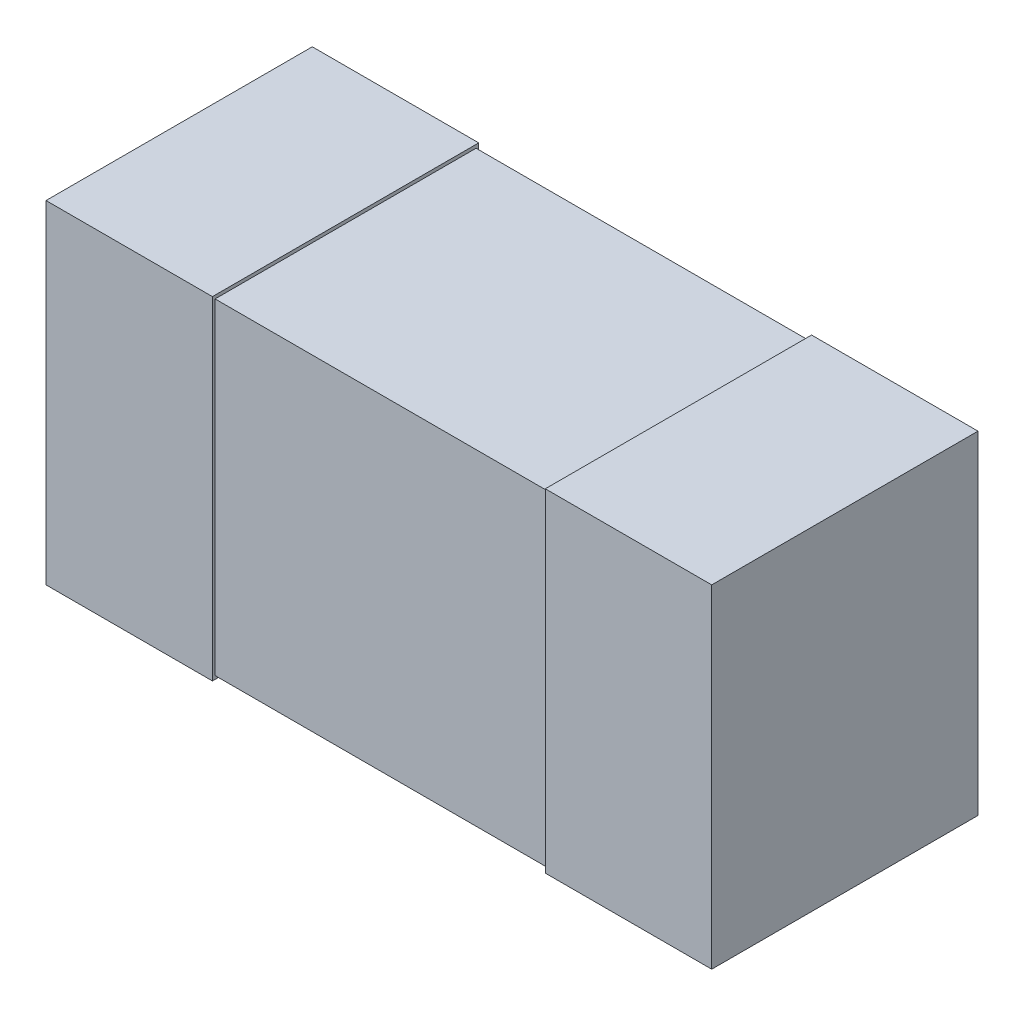
ISO-10303-21;
HEADER;
FILE_DESCRIPTION(('STEP AP214'),'2;1');
FILE_NAME('part.step','',(''),(''),'','','');
FILE_SCHEMA(('AUTOMOTIVE_DESIGN { 1 0 10303 214 1 1 1 1 }'));
ENDSEC;
DATA;
#1=APPLICATION_CONTEXT('core data for automotive mechanical design processes');
#2=APPLICATION_PROTOCOL_DEFINITION('international standard','automotive_design',2000,#1);
#3=PRODUCT_CONTEXT('',#1,'mechanical');
#4=PRODUCT('Part','Part','',(#3));
#5=PRODUCT_RELATED_PRODUCT_CATEGORY('part','',(#4));
#6=PRODUCT_DEFINITION_FORMATION('','',#4);
#7=PRODUCT_DEFINITION_CONTEXT('part definition',#1,'design');
#8=PRODUCT_DEFINITION('design','',#6,#7);
#9=PRODUCT_DEFINITION_SHAPE('','',#8);
#10=(LENGTH_UNIT() NAMED_UNIT(*) SI_UNIT(.MILLI.,.METRE.));
#11=(NAMED_UNIT(*) PLANE_ANGLE_UNIT() SI_UNIT($,.RADIAN.));
#12=(NAMED_UNIT(*) SI_UNIT($,.STERADIAN.) SOLID_ANGLE_UNIT());
#13=UNCERTAINTY_MEASURE_WITH_UNIT(LENGTH_MEASURE(1.E-05),#10,'distance_accuracy_value','');
#14=(GEOMETRIC_REPRESENTATION_CONTEXT(3) GLOBAL_UNCERTAINTY_ASSIGNED_CONTEXT((#13)) GLOBAL_UNIT_ASSIGNED_CONTEXT((#10,
#11,#12)) REPRESENTATION_CONTEXT('',''));
#15=CARTESIAN_POINT('',(0.,0.,0.));
#16=DIRECTION('',(0.,0.,1.));
#17=DIRECTION('',(1.,0.,0.));
#18=AXIS2_PLACEMENT_3D('',#15,#16,#17);
#19=CARTESIAN_POINT('',(-0.25,0.25,0.));
#20=DIRECTION('',(1.,0.,0.));
#21=DIRECTION('',(0.,0.,1.));
#22=AXIS2_PLACEMENT_3D('',#19,#20,#21);
#23=PLANE('',#22);
#24=DIRECTION('',(0.,0.,-1.));
#25=VECTOR('',#24,1.);
#26=CARTESIAN_POINT('',(-0.25,0.25,0.2));
#27=LINE('',#26,#25);
#28=CARTESIAN_POINT('',(-0.25,0.25,0.4));
#29=VERTEX_POINT('',#28);
#30=CARTESIAN_POINT('',(-0.25,0.25,0.));
#31=VERTEX_POINT('',#30);
#32=EDGE_CURVE('P0_E77',#29,#31,#27,.T.);
#33=ORIENTED_EDGE('',*,*,#32,.F.);
#34=DIRECTION('',(0.,1.,0.));
#35=VECTOR('',#34,1.);
#36=CARTESIAN_POINT('',(-0.25,0.,0.4));
#37=LINE('',#36,#35);
#38=CARTESIAN_POINT('',(-0.25,-0.25,0.4));
#39=VERTEX_POINT('',#38);
#40=EDGE_CURVE('P0_E59',#39,#29,#37,.T.);
#41=ORIENTED_EDGE('',*,*,#40,.F.);
#42=DIRECTION('',(0.,0.,-1.));
#43=VECTOR('',#42,1.);
#44=CARTESIAN_POINT('',(-0.25,-0.25,0.2));
#45=LINE('',#44,#43);
#46=CARTESIAN_POINT('',(-0.25,-0.25,0.));
#47=VERTEX_POINT('',#46);
#48=EDGE_CURVE('P0_E21',#39,#47,#45,.T.);
#49=ORIENTED_EDGE('',*,*,#48,.T.);
#50=DIRECTION('',(0.,1.,0.));
#51=VECTOR('',#50,1.);
#52=CARTESIAN_POINT('',(-0.25,0.,0.));
#53=LINE('',#52,#51);
#54=EDGE_CURVE('P0_E56',#47,#31,#53,.T.);
#55=ORIENTED_EDGE('',*,*,#54,.T.);
#56=EDGE_LOOP('',(#33,#41,#49,#55));
#57=FACE_BOUND('',#56,.T.);
#58=ADVANCED_FACE('P0_F17',(#57),#23,.T.);
#59=CARTESIAN_POINT('',(-0.5,-0.25,0.));
#60=DIRECTION('',(0.,1.,0.));
#61=DIRECTION('',(0.,0.,1.));
#62=AXIS2_PLACEMENT_3D('',#59,#60,#61);
#63=PLANE('',#62);
#64=DIRECTION('',(1.,0.,0.));
#65=VECTOR('',#64,1.);
#66=CARTESIAN_POINT('',(-0.375,-0.25,0.4));
#67=LINE('',#66,#65);
#68=CARTESIAN_POINT('',(-0.5,-0.25,0.4));
#69=VERTEX_POINT('',#68);
#70=EDGE_CURVE('P0_E79',#69,#39,#67,.T.);
#71=ORIENTED_EDGE('',*,*,#70,.F.);
#72=DIRECTION('',(0.,0.,-1.));
#73=VECTOR('',#72,1.);
#74=CARTESIAN_POINT('',(-0.5,-0.25,0.2));
#75=LINE('',#74,#73);
#76=CARTESIAN_POINT('',(-0.5,-0.25,0.));
#77=VERTEX_POINT('',#76);
#78=EDGE_CURVE('P0_E74',#69,#77,#75,.T.);
#79=ORIENTED_EDGE('',*,*,#78,.T.);
#80=DIRECTION('',(1.,0.,0.));
#81=VECTOR('',#80,1.);
#82=CARTESIAN_POINT('',(-0.375,-0.25,0.));
#83=LINE('',#82,#81);
#84=EDGE_CURVE('P0_E64',#77,#47,#83,.T.);
#85=ORIENTED_EDGE('',*,*,#84,.T.);
#86=ORIENTED_EDGE('',*,*,#48,.F.);
#87=EDGE_LOOP('',(#71,#79,#85,#86));
#88=FACE_BOUND('',#87,.T.);
#89=ADVANCED_FACE('P0_F73',(#88),#63,.F.);
#90=CARTESIAN_POINT('',(-0.5,-0.25,0.));
#91=DIRECTION('',(0.,0.,1.));
#92=DIRECTION('',(1.,0.,0.));
#93=AXIS2_PLACEMENT_3D('',#90,#91,#92);
#94=PLANE('',#93);
#95=ORIENTED_EDGE('',*,*,#54,.F.);
#96=ORIENTED_EDGE('',*,*,#84,.F.);
#97=DIRECTION('',(0.,1.,0.));
#98=VECTOR('',#97,1.);
#99=CARTESIAN_POINT('',(-0.5,0.,0.));
#100=LINE('',#99,#98);
#101=CARTESIAN_POINT('',(-0.5,0.25,0.));
#102=VERTEX_POINT('',#101);
#103=EDGE_CURVE('P0_E84',#77,#102,#100,.T.);
#104=ORIENTED_EDGE('',*,*,#103,.T.);
#105=DIRECTION('',(-1.,0.,0.));
#106=VECTOR('',#105,1.);
#107=CARTESIAN_POINT('',(-0.375,0.25,0.));
#108=LINE('',#107,#106);
#109=EDGE_CURVE('P0_E70',#31,#102,#108,.T.);
#110=ORIENTED_EDGE('',*,*,#109,.F.);
#111=EDGE_LOOP('',(#95,#96,#104,#110));
#112=FACE_BOUND('',#111,.T.);
#113=ADVANCED_FACE('P0_F67',(#112),#94,.F.);
#114=CARTESIAN_POINT('',(-0.5,0.25,0.));
#115=DIRECTION('',(0.,1.,0.));
#116=DIRECTION('',(0.,0.,1.));
#117=AXIS2_PLACEMENT_3D('',#114,#115,#116);
#118=PLANE('',#117);
#119=DIRECTION('',(-1.,0.,0.));
#120=VECTOR('',#119,1.);
#121=CARTESIAN_POINT('',(-0.375,0.25,0.4));
#122=LINE('',#121,#120);
#123=CARTESIAN_POINT('',(-0.5,0.25,0.4));
#124=VERTEX_POINT('',#123);
#125=EDGE_CURVE('P0_E35',#29,#124,#122,.T.);
#126=ORIENTED_EDGE('',*,*,#125,.F.);
#127=ORIENTED_EDGE('',*,*,#32,.T.);
#128=ORIENTED_EDGE('',*,*,#109,.T.);
#129=DIRECTION('',(0.,0.,1.));
#130=VECTOR('',#129,1.);
#131=CARTESIAN_POINT('',(-0.5,0.25,0.2));
#132=LINE('',#131,#130);
#133=EDGE_CURVE('P0_E27',#102,#124,#132,.T.);
#134=ORIENTED_EDGE('',*,*,#133,.T.);
#135=EDGE_LOOP('',(#126,#127,#128,#134));
#136=FACE_BOUND('',#135,.T.);
#137=ADVANCED_FACE('P0_F89',(#136),#118,.T.);
#138=CARTESIAN_POINT('',(-0.5,-0.25,0.4));
#139=DIRECTION('',(0.,0.,1.));
#140=DIRECTION('',(1.,0.,0.));
#141=AXIS2_PLACEMENT_3D('',#138,#139,#140);
#142=PLANE('',#141);
#143=ORIENTED_EDGE('',*,*,#40,.T.);
#144=ORIENTED_EDGE('',*,*,#125,.T.);
#145=DIRECTION('',(0.,-1.,0.));
#146=VECTOR('',#145,1.);
#147=CARTESIAN_POINT('',(-0.5,0.,0.4));
#148=LINE('',#147,#146);
#149=EDGE_CURVE('P0_E11',#124,#69,#148,.T.);
#150=ORIENTED_EDGE('',*,*,#149,.T.);
#151=ORIENTED_EDGE('',*,*,#70,.T.);
#152=EDGE_LOOP('',(#143,#144,#150,#151));
#153=FACE_BOUND('',#152,.T.);
#154=ADVANCED_FACE('P0_F91',(#153),#142,.T.);
#155=CARTESIAN_POINT('',(-0.5,0.25,0.));
#156=DIRECTION('',(1.,0.,0.));
#157=DIRECTION('',(0.,0.,1.));
#158=AXIS2_PLACEMENT_3D('',#155,#156,#157);
#159=PLANE('',#158);
#160=ORIENTED_EDGE('',*,*,#133,.F.);
#161=ORIENTED_EDGE('',*,*,#103,.F.);
#162=ORIENTED_EDGE('',*,*,#78,.F.);
#163=ORIENTED_EDGE('',*,*,#149,.F.);
#164=EDGE_LOOP('',(#160,#161,#162,#163));
#165=FACE_BOUND('',#164,.T.);
#166=ADVANCED_FACE('P0_F19',(#165),#159,.F.);
#167=CLOSED_SHELL('',(#58,#89,#113,#137,#154,#166));
#168=MANIFOLD_SOLID_BREP('P0_B1',#167);
#169=CARTESIAN_POINT('',(-0.25,-0.245,0.396));
#170=DIRECTION('',(0.,0.,1.));
#171=DIRECTION('',(1.,0.,0.));
#172=AXIS2_PLACEMENT_3D('',#169,#170,#171);
#173=PLANE('',#172);
#174=DIRECTION('',(0.,-1.,0.));
#175=VECTOR('',#174,1.);
#176=CARTESIAN_POINT('',(0.25,0.,0.396));
#177=LINE('',#176,#175);
#178=CARTESIAN_POINT('',(0.25,0.245,0.396));
#179=VERTEX_POINT('',#178);
#180=CARTESIAN_POINT('',(0.25,-0.245,0.396));
#181=VERTEX_POINT('',#180);
#182=EDGE_CURVE('P1_E77',#179,#181,#177,.T.);
#183=ORIENTED_EDGE('',*,*,#182,.F.);
#184=DIRECTION('',(1.,0.,0.));
#185=VECTOR('',#184,1.);
#186=CARTESIAN_POINT('',(0.,0.245,0.396));
#187=LINE('',#186,#185);
#188=CARTESIAN_POINT('',(-0.25,0.245,0.396));
#189=VERTEX_POINT('',#188);
#190=EDGE_CURVE('P1_E59',#189,#179,#187,.T.);
#191=ORIENTED_EDGE('',*,*,#190,.F.);
#192=DIRECTION('',(0.,-1.,0.));
#193=VECTOR('',#192,1.);
#194=CARTESIAN_POINT('',(-0.25,0.,0.396));
#195=LINE('',#194,#193);
#196=CARTESIAN_POINT('',(-0.25,-0.245,0.396));
#197=VERTEX_POINT('',#196);
#198=EDGE_CURVE('P1_E21',#189,#197,#195,.T.);
#199=ORIENTED_EDGE('',*,*,#198,.T.);
#200=DIRECTION('',(1.,0.,0.));
#201=VECTOR('',#200,1.);
#202=CARTESIAN_POINT('',(0.,-0.245,0.396));
#203=LINE('',#202,#201);
#204=EDGE_CURVE('P1_E56',#197,#181,#203,.T.);
#205=ORIENTED_EDGE('',*,*,#204,.T.);
#206=EDGE_LOOP('',(#183,#191,#199,#205));
#207=FACE_BOUND('',#206,.T.);
#208=ADVANCED_FACE('P1_F17',(#207),#173,.T.);
#209=CARTESIAN_POINT('',(-0.25,0.245,0.004));
#210=DIRECTION('',(1.,0.,0.));
#211=DIRECTION('',(0.,0.,1.));
#212=AXIS2_PLACEMENT_3D('',#209,#210,#211);
#213=PLANE('',#212);
#214=DIRECTION('',(0.,0.,1.));
#215=VECTOR('',#214,1.);
#216=CARTESIAN_POINT('',(-0.25,0.245,0.2));
#217=LINE('',#216,#215);
#218=CARTESIAN_POINT('',(-0.25,0.245,0.004));
#219=VERTEX_POINT('',#218);
#220=EDGE_CURVE('P1_E79',#219,#189,#217,.T.);
#221=ORIENTED_EDGE('',*,*,#220,.F.);
#222=DIRECTION('',(0.,-1.,0.));
#223=VECTOR('',#222,1.);
#224=CARTESIAN_POINT('',(-0.25,0.,0.004));
#225=LINE('',#224,#223);
#226=CARTESIAN_POINT('',(-0.25,-0.245,0.004));
#227=VERTEX_POINT('',#226);
#228=EDGE_CURVE('P1_E74',#219,#227,#225,.T.);
#229=ORIENTED_EDGE('',*,*,#228,.T.);
#230=DIRECTION('',(0.,0.,1.));
#231=VECTOR('',#230,1.);
#232=CARTESIAN_POINT('',(-0.25,-0.245,0.2));
#233=LINE('',#232,#231);
#234=EDGE_CURVE('P1_E64',#227,#197,#233,.T.);
#235=ORIENTED_EDGE('',*,*,#234,.T.);
#236=ORIENTED_EDGE('',*,*,#198,.F.);
#237=EDGE_LOOP('',(#221,#229,#235,#236));
#238=FACE_BOUND('',#237,.T.);
#239=ADVANCED_FACE('P1_F73',(#238),#213,.F.);
#240=CARTESIAN_POINT('',(-0.25,-0.245,0.004));
#241=DIRECTION('',(0.,1.,0.));
#242=DIRECTION('',(0.,0.,1.));
#243=AXIS2_PLACEMENT_3D('',#240,#241,#242);
#244=PLANE('',#243);
#245=ORIENTED_EDGE('',*,*,#204,.F.);
#246=ORIENTED_EDGE('',*,*,#234,.F.);
#247=DIRECTION('',(1.,0.,0.));
#248=VECTOR('',#247,1.);
#249=CARTESIAN_POINT('',(0.,-0.245,0.004));
#250=LINE('',#249,#248);
#251=CARTESIAN_POINT('',(0.25,-0.245,0.004));
#252=VERTEX_POINT('',#251);
#253=EDGE_CURVE('P1_E84',#227,#252,#250,.T.);
#254=ORIENTED_EDGE('',*,*,#253,.T.);
#255=DIRECTION('',(0.,0.,-1.));
#256=VECTOR('',#255,1.);
#257=CARTESIAN_POINT('',(0.25,-0.245,0.2));
#258=LINE('',#257,#256);
#259=EDGE_CURVE('P1_E70',#181,#252,#258,.T.);
#260=ORIENTED_EDGE('',*,*,#259,.F.);
#261=EDGE_LOOP('',(#245,#246,#254,#260));
#262=FACE_BOUND('',#261,.T.);
#263=ADVANCED_FACE('P1_F67',(#262),#244,.F.);
#264=CARTESIAN_POINT('',(0.25,0.245,0.004));
#265=DIRECTION('',(1.,0.,0.));
#266=DIRECTION('',(0.,0.,1.));
#267=AXIS2_PLACEMENT_3D('',#264,#265,#266);
#268=PLANE('',#267);
#269=DIRECTION('',(0.,0.,-1.));
#270=VECTOR('',#269,1.);
#271=CARTESIAN_POINT('',(0.25,0.245,0.2));
#272=LINE('',#271,#270);
#273=CARTESIAN_POINT('',(0.25,0.245,0.004));
#274=VERTEX_POINT('',#273);
#275=EDGE_CURVE('P1_E35',#179,#274,#272,.T.);
#276=ORIENTED_EDGE('',*,*,#275,.F.);
#277=ORIENTED_EDGE('',*,*,#182,.T.);
#278=ORIENTED_EDGE('',*,*,#259,.T.);
#279=DIRECTION('',(0.,1.,0.));
#280=VECTOR('',#279,1.);
#281=CARTESIAN_POINT('',(0.25,0.,0.004));
#282=LINE('',#281,#280);
#283=EDGE_CURVE('P1_E27',#252,#274,#282,.T.);
#284=ORIENTED_EDGE('',*,*,#283,.T.);
#285=EDGE_LOOP('',(#276,#277,#278,#284));
#286=FACE_BOUND('',#285,.T.);
#287=ADVANCED_FACE('P1_F89',(#286),#268,.T.);
#288=CARTESIAN_POINT('',(-0.25,0.245,0.004));
#289=DIRECTION('',(0.,1.,0.));
#290=DIRECTION('',(0.,0.,1.));
#291=AXIS2_PLACEMENT_3D('',#288,#289,#290);
#292=PLANE('',#291);
#293=ORIENTED_EDGE('',*,*,#190,.T.);
#294=ORIENTED_EDGE('',*,*,#275,.T.);
#295=DIRECTION('',(-1.,0.,0.));
#296=VECTOR('',#295,1.);
#297=CARTESIAN_POINT('',(0.,0.245,0.004));
#298=LINE('',#297,#296);
#299=EDGE_CURVE('P1_E11',#274,#219,#298,.T.);
#300=ORIENTED_EDGE('',*,*,#299,.T.);
#301=ORIENTED_EDGE('',*,*,#220,.T.);
#302=EDGE_LOOP('',(#293,#294,#300,#301));
#303=FACE_BOUND('',#302,.T.);
#304=ADVANCED_FACE('P1_F91',(#303),#292,.T.);
#305=CARTESIAN_POINT('',(-0.25,-0.245,0.004));
#306=DIRECTION('',(0.,0.,1.));
#307=DIRECTION('',(1.,0.,0.));
#308=AXIS2_PLACEMENT_3D('',#305,#306,#307);
#309=PLANE('',#308);
#310=ORIENTED_EDGE('',*,*,#283,.F.);
#311=ORIENTED_EDGE('',*,*,#253,.F.);
#312=ORIENTED_EDGE('',*,*,#228,.F.);
#313=ORIENTED_EDGE('',*,*,#299,.F.);
#314=EDGE_LOOP('',(#310,#311,#312,#313));
#315=FACE_BOUND('',#314,.T.);
#316=ADVANCED_FACE('P1_F19',(#315),#309,.F.);
#317=CLOSED_SHELL('',(#208,#239,#263,#287,#304,#316));
#318=MANIFOLD_SOLID_BREP('P1_B1',#317);
#319=CARTESIAN_POINT('',(0.5,0.25,0.));
#320=DIRECTION('',(1.,0.,0.));
#321=DIRECTION('',(0.,0.,1.));
#322=AXIS2_PLACEMENT_3D('',#319,#320,#321);
#323=PLANE('',#322);
#324=DIRECTION('',(0.,0.,-1.));
#325=VECTOR('',#324,1.);
#326=CARTESIAN_POINT('',(0.5,0.25,0.2));
#327=LINE('',#326,#325);
#328=CARTESIAN_POINT('',(0.5,0.25,0.4));
#329=VERTEX_POINT('',#328);
#330=CARTESIAN_POINT('',(0.5,0.25,0.));
#331=VERTEX_POINT('',#330);
#332=EDGE_CURVE('P2_E77',#329,#331,#327,.T.);
#333=ORIENTED_EDGE('',*,*,#332,.F.);
#334=DIRECTION('',(0.,1.,0.));
#335=VECTOR('',#334,1.);
#336=CARTESIAN_POINT('',(0.5,0.,0.4));
#337=LINE('',#336,#335);
#338=CARTESIAN_POINT('',(0.5,-0.25,0.4));
#339=VERTEX_POINT('',#338);
#340=EDGE_CURVE('P2_E59',#339,#329,#337,.T.);
#341=ORIENTED_EDGE('',*,*,#340,.F.);
#342=DIRECTION('',(0.,0.,-1.));
#343=VECTOR('',#342,1.);
#344=CARTESIAN_POINT('',(0.5,-0.25,0.2));
#345=LINE('',#344,#343);
#346=CARTESIAN_POINT('',(0.5,-0.25,0.));
#347=VERTEX_POINT('',#346);
#348=EDGE_CURVE('P2_E21',#339,#347,#345,.T.);
#349=ORIENTED_EDGE('',*,*,#348,.T.);
#350=DIRECTION('',(0.,1.,0.));
#351=VECTOR('',#350,1.);
#352=CARTESIAN_POINT('',(0.5,0.,0.));
#353=LINE('',#352,#351);
#354=EDGE_CURVE('P2_E56',#347,#331,#353,.T.);
#355=ORIENTED_EDGE('',*,*,#354,.T.);
#356=EDGE_LOOP('',(#333,#341,#349,#355));
#357=FACE_BOUND('',#356,.T.);
#358=ADVANCED_FACE('P2_F17',(#357),#323,.T.);
#359=CARTESIAN_POINT('',(0.25,-0.25,0.));
#360=DIRECTION('',(0.,1.,0.));
#361=DIRECTION('',(0.,0.,1.));
#362=AXIS2_PLACEMENT_3D('',#359,#360,#361);
#363=PLANE('',#362);
#364=DIRECTION('',(1.,0.,0.));
#365=VECTOR('',#364,1.);
#366=CARTESIAN_POINT('',(0.375,-0.25,0.4));
#367=LINE('',#366,#365);
#368=CARTESIAN_POINT('',(0.25,-0.25,0.4));
#369=VERTEX_POINT('',#368);
#370=EDGE_CURVE('P2_E79',#369,#339,#367,.T.);
#371=ORIENTED_EDGE('',*,*,#370,.F.);
#372=DIRECTION('',(0.,0.,-1.));
#373=VECTOR('',#372,1.);
#374=CARTESIAN_POINT('',(0.25,-0.25,0.2));
#375=LINE('',#374,#373);
#376=CARTESIAN_POINT('',(0.25,-0.25,0.));
#377=VERTEX_POINT('',#376);
#378=EDGE_CURVE('P2_E74',#369,#377,#375,.T.);
#379=ORIENTED_EDGE('',*,*,#378,.T.);
#380=DIRECTION('',(1.,0.,0.));
#381=VECTOR('',#380,1.);
#382=CARTESIAN_POINT('',(0.375,-0.25,0.));
#383=LINE('',#382,#381);
#384=EDGE_CURVE('P2_E64',#377,#347,#383,.T.);
#385=ORIENTED_EDGE('',*,*,#384,.T.);
#386=ORIENTED_EDGE('',*,*,#348,.F.);
#387=EDGE_LOOP('',(#371,#379,#385,#386));
#388=FACE_BOUND('',#387,.T.);
#389=ADVANCED_FACE('P2_F73',(#388),#363,.F.);
#390=CARTESIAN_POINT('',(0.25,-0.25,0.));
#391=DIRECTION('',(0.,0.,1.));
#392=DIRECTION('',(1.,0.,0.));
#393=AXIS2_PLACEMENT_3D('',#390,#391,#392);
#394=PLANE('',#393);
#395=ORIENTED_EDGE('',*,*,#354,.F.);
#396=ORIENTED_EDGE('',*,*,#384,.F.);
#397=DIRECTION('',(0.,1.,0.));
#398=VECTOR('',#397,1.);
#399=CARTESIAN_POINT('',(0.25,0.,0.));
#400=LINE('',#399,#398);
#401=CARTESIAN_POINT('',(0.25,0.25,0.));
#402=VERTEX_POINT('',#401);
#403=EDGE_CURVE('P2_E84',#377,#402,#400,.T.);
#404=ORIENTED_EDGE('',*,*,#403,.T.);
#405=DIRECTION('',(-1.,0.,0.));
#406=VECTOR('',#405,1.);
#407=CARTESIAN_POINT('',(0.375,0.25,0.));
#408=LINE('',#407,#406);
#409=EDGE_CURVE('P2_E70',#331,#402,#408,.T.);
#410=ORIENTED_EDGE('',*,*,#409,.F.);
#411=EDGE_LOOP('',(#395,#396,#404,#410));
#412=FACE_BOUND('',#411,.T.);
#413=ADVANCED_FACE('P2_F67',(#412),#394,.F.);
#414=CARTESIAN_POINT('',(0.25,0.25,0.));
#415=DIRECTION('',(0.,1.,0.));
#416=DIRECTION('',(0.,0.,1.));
#417=AXIS2_PLACEMENT_3D('',#414,#415,#416);
#418=PLANE('',#417);
#419=DIRECTION('',(-1.,0.,0.));
#420=VECTOR('',#419,1.);
#421=CARTESIAN_POINT('',(0.375,0.25,0.4));
#422=LINE('',#421,#420);
#423=CARTESIAN_POINT('',(0.25,0.25,0.4));
#424=VERTEX_POINT('',#423);
#425=EDGE_CURVE('P2_E35',#329,#424,#422,.T.);
#426=ORIENTED_EDGE('',*,*,#425,.F.);
#427=ORIENTED_EDGE('',*,*,#332,.T.);
#428=ORIENTED_EDGE('',*,*,#409,.T.);
#429=DIRECTION('',(0.,0.,1.));
#430=VECTOR('',#429,1.);
#431=CARTESIAN_POINT('',(0.25,0.25,0.2));
#432=LINE('',#431,#430);
#433=EDGE_CURVE('P2_E27',#402,#424,#432,.T.);
#434=ORIENTED_EDGE('',*,*,#433,.T.);
#435=EDGE_LOOP('',(#426,#427,#428,#434));
#436=FACE_BOUND('',#435,.T.);
#437=ADVANCED_FACE('P2_F89',(#436),#418,.T.);
#438=CARTESIAN_POINT('',(0.25,-0.25,0.4));
#439=DIRECTION('',(0.,0.,1.));
#440=DIRECTION('',(1.,0.,0.));
#441=AXIS2_PLACEMENT_3D('',#438,#439,#440);
#442=PLANE('',#441);
#443=ORIENTED_EDGE('',*,*,#340,.T.);
#444=ORIENTED_EDGE('',*,*,#425,.T.);
#445=DIRECTION('',(0.,-1.,0.));
#446=VECTOR('',#445,1.);
#447=CARTESIAN_POINT('',(0.25,0.,0.4));
#448=LINE('',#447,#446);
#449=EDGE_CURVE('P2_E11',#424,#369,#448,.T.);
#450=ORIENTED_EDGE('',*,*,#449,.T.);
#451=ORIENTED_EDGE('',*,*,#370,.T.);
#452=EDGE_LOOP('',(#443,#444,#450,#451));
#453=FACE_BOUND('',#452,.T.);
#454=ADVANCED_FACE('P2_F91',(#453),#442,.T.);
#455=CARTESIAN_POINT('',(0.25,0.25,0.));
#456=DIRECTION('',(1.,0.,0.));
#457=DIRECTION('',(0.,0.,1.));
#458=AXIS2_PLACEMENT_3D('',#455,#456,#457);
#459=PLANE('',#458);
#460=ORIENTED_EDGE('',*,*,#433,.F.);
#461=ORIENTED_EDGE('',*,*,#403,.F.);
#462=ORIENTED_EDGE('',*,*,#378,.F.);
#463=ORIENTED_EDGE('',*,*,#449,.F.);
#464=EDGE_LOOP('',(#460,#461,#462,#463));
#465=FACE_BOUND('',#464,.T.);
#466=ADVANCED_FACE('P2_F19',(#465),#459,.F.);
#467=CLOSED_SHELL('',(#358,#389,#413,#437,#454,#466));
#468=MANIFOLD_SOLID_BREP('P2_B1',#467);
#469=ADVANCED_BREP_SHAPE_REPRESENTATION('',(#18,#168,#318,#468),#14);
#470=SHAPE_DEFINITION_REPRESENTATION(#9,#469);
ENDSEC;
END-ISO-10303-21;
